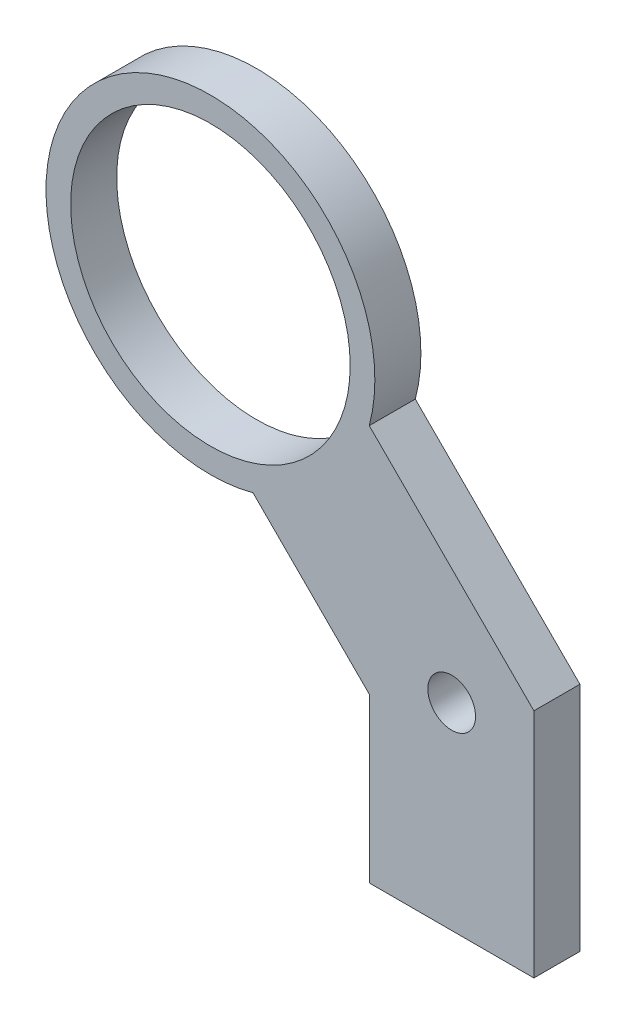
ISO-10303-21;
HEADER;
FILE_DESCRIPTION(('STEP AP214'),'2;1');
FILE_NAME('part.step','',(''),(''),'','','');
FILE_SCHEMA(('AUTOMOTIVE_DESIGN { 1 0 10303 214 1 1 1 1 }'));
ENDSEC;
DATA;
#1=APPLICATION_CONTEXT('core data for automotive mechanical design processes');
#2=APPLICATION_PROTOCOL_DEFINITION('international standard','automotive_design',2000,#1);
#3=PRODUCT_CONTEXT('',#1,'mechanical');
#4=PRODUCT('Part','Part','',(#3));
#5=PRODUCT_RELATED_PRODUCT_CATEGORY('part','',(#4));
#6=PRODUCT_DEFINITION_FORMATION('','',#4);
#7=PRODUCT_DEFINITION_CONTEXT('part definition',#1,'design');
#8=PRODUCT_DEFINITION('design','',#6,#7);
#9=PRODUCT_DEFINITION_SHAPE('','',#8);
#10=(LENGTH_UNIT() NAMED_UNIT(*) SI_UNIT(.MILLI.,.METRE.));
#11=(NAMED_UNIT(*) PLANE_ANGLE_UNIT() SI_UNIT($,.RADIAN.));
#12=(NAMED_UNIT(*) SI_UNIT($,.STERADIAN.) SOLID_ANGLE_UNIT());
#13=UNCERTAINTY_MEASURE_WITH_UNIT(LENGTH_MEASURE(1.E-05),#10,'distance_accuracy_value','');
#14=(GEOMETRIC_REPRESENTATION_CONTEXT(3) GLOBAL_UNCERTAINTY_ASSIGNED_CONTEXT((#13)) GLOBAL_UNIT_ASSIGNED_CONTEXT((#10,
#11,#12)) REPRESENTATION_CONTEXT('',''));
#15=CARTESIAN_POINT('',(0.,0.,0.));
#16=DIRECTION('',(0.,0.,1.));
#17=DIRECTION('',(1.,0.,0.));
#18=AXIS2_PLACEMENT_3D('',#15,#16,#17);
#19=CARTESIAN_POINT('',(-29.3449314192418,29.3449314192417,5.6));
#20=DIRECTION('',(0.,0.,1.));
#21=DIRECTION('',(1.,0.,0.));
#22=AXIS2_PLACEMENT_3D('',#19,#20,#21);
#23=PLANE('',#22);
#24=CARTESIAN_POINT('',(-29.3449314192418,29.3449314192417,5.6));
#25=DIRECTION('',(0.,0.,1.));
#26=DIRECTION('',(1.,0.,0.));
#27=AXIS2_PLACEMENT_3D('',#24,#25,#26);
#28=CIRCLE('',#27,17.);
#29=CARTESIAN_POINT('',(-12.3449314192418,29.3449314192417,5.6));
#30=VERTEX_POINT('',#29);
#31=EDGE_CURVE('E174',#30,#30,#28,.T.);
#32=ORIENTED_EDGE('',*,*,#31,.F.);
#33=EDGE_LOOP('',(#32));
#34=FACE_BOUND('',#33,.T.);
#35=CARTESIAN_POINT('',(-29.3449314192418,29.3449314192417,5.6));
#36=DIRECTION('',(0.,0.,1.));
#37=DIRECTION('',(1.,0.,0.));
#38=AXIS2_PLACEMENT_3D('',#35,#36,#37);
#39=CIRCLE('',#38,20.);
#40=CARTESIAN_POINT('',(-10.0264148934604,24.1685505171913,5.6));
#41=VERTEX_POINT('',#40);
#42=CARTESIAN_POINT('',(-24.1685505171913,10.0264148934603,5.6));
#43=VERTEX_POINT('',#42);
#44=EDGE_CURVE('E129',#41,#43,#39,.T.);
#45=ORIENTED_EDGE('',*,*,#44,.T.);
#46=DIRECTION('',(0.707106781186549,-0.707106781186546,0.));
#47=VECTOR('',#46,1.);
#48=CARTESIAN_POINT('',(-10.,-4.14213562373095,5.6));
#49=LINE('',#48,#47);
#50=CARTESIAN_POINT('',(-10.,-4.14213562373095,5.6));
#51=VERTEX_POINT('',#50);
#52=EDGE_CURVE('E87',#43,#51,#49,.T.);
#53=ORIENTED_EDGE('',*,*,#52,.T.);
#54=DIRECTION('',(0.,-1.,0.));
#55=VECTOR('',#54,1.);
#56=CARTESIAN_POINT('',(-10.,-4.14213562373095,5.6));
#57=LINE('',#56,#55);
#58=CARTESIAN_POINT('',(-10.,-24.,5.6));
#59=VERTEX_POINT('',#58);
#60=EDGE_CURVE('E100',#51,#59,#57,.T.);
#61=ORIENTED_EDGE('',*,*,#60,.T.);
#62=DIRECTION('',(1.,0.,0.));
#63=VECTOR('',#62,1.);
#64=CARTESIAN_POINT('',(-10.,-24.,5.6));
#65=LINE('',#64,#63);
#66=CARTESIAN_POINT('',(10.,-24.,5.6));
#67=VERTEX_POINT('',#66);
#68=EDGE_CURVE('E94',#59,#67,#65,.T.);
#69=ORIENTED_EDGE('',*,*,#68,.T.);
#70=DIRECTION('',(0.,1.,0.));
#71=VECTOR('',#70,1.);
#72=CARTESIAN_POINT('',(10.,-24.,5.6));
#73=LINE('',#72,#71);
#74=CARTESIAN_POINT('',(10.,4.14213562373095,5.6));
#75=VERTEX_POINT('',#74);
#76=EDGE_CURVE('E98',#67,#75,#73,.T.);
#77=ORIENTED_EDGE('',*,*,#76,.T.);
#78=DIRECTION('',(-0.707106781186549,0.707106781186546,0.));
#79=VECTOR('',#78,1.);
#80=CARTESIAN_POINT('',(10.,4.14213562373095,5.6));
#81=LINE('',#80,#79);
#82=EDGE_CURVE('E50',#75,#41,#81,.T.);
#83=ORIENTED_EDGE('',*,*,#82,.T.);
#84=EDGE_LOOP('',(#45,#53,#61,#69,#77,#83));
#85=FACE_BOUND('',#84,.T.);
#86=CARTESIAN_POINT('',(0.,0.,5.6));
#87=DIRECTION('',(0.,0.,1.));
#88=DIRECTION('',(1.,0.,0.));
#89=AXIS2_PLACEMENT_3D('',#86,#87,#88);
#90=CIRCLE('',#89,2.9);
#91=CARTESIAN_POINT('',(2.9,0.,5.6));
#92=VERTEX_POINT('',#91);
#93=EDGE_CURVE('E122',#92,#92,#90,.T.);
#94=ORIENTED_EDGE('',*,*,#93,.F.);
#95=EDGE_LOOP('',(#94));
#96=FACE_BOUND('',#95,.T.);
#97=ADVANCED_FACE('F33',(#34,#85,#96),#23,.T.);
#98=CARTESIAN_POINT('',(-29.3449314192418,29.3449314192417,0.));
#99=DIRECTION('',(0.,0.,1.));
#100=DIRECTION('',(1.,0.,0.));
#101=AXIS2_PLACEMENT_3D('',#98,#99,#100);
#102=PLANE('',#101);
#103=CARTESIAN_POINT('',(-29.3449314192418,29.3449314192417,0.));
#104=DIRECTION('',(0.,0.,1.));
#105=DIRECTION('',(1.,0.,0.));
#106=AXIS2_PLACEMENT_3D('',#103,#104,#105);
#107=CIRCLE('',#106,17.);
#108=CARTESIAN_POINT('',(-12.3449314192418,29.3449314192417,0.));
#109=VERTEX_POINT('',#108);
#110=EDGE_CURVE('E172',#109,#109,#107,.T.);
#111=ORIENTED_EDGE('',*,*,#110,.T.);
#112=EDGE_LOOP('',(#111));
#113=FACE_BOUND('',#112,.T.);
#114=CARTESIAN_POINT('',(-29.3449314192418,29.3449314192417,0.));
#115=DIRECTION('',(0.,0.,1.));
#116=DIRECTION('',(1.,0.,0.));
#117=AXIS2_PLACEMENT_3D('',#114,#115,#116);
#118=CIRCLE('',#117,20.);
#119=CARTESIAN_POINT('',(-10.0264148934604,24.1685505171913,0.));
#120=VERTEX_POINT('',#119);
#121=CARTESIAN_POINT('',(-24.1685505171913,10.0264148934603,0.));
#122=VERTEX_POINT('',#121);
#123=EDGE_CURVE('E118',#120,#122,#118,.T.);
#124=ORIENTED_EDGE('',*,*,#123,.F.);
#125=DIRECTION('',(-0.707106781186549,0.707106781186546,0.));
#126=VECTOR('',#125,1.);
#127=CARTESIAN_POINT('',(10.,4.14213562373095,0.));
#128=LINE('',#127,#126);
#129=CARTESIAN_POINT('',(10.,4.14213562373095,0.));
#130=VERTEX_POINT('',#129);
#131=EDGE_CURVE('E79',#130,#120,#128,.T.);
#132=ORIENTED_EDGE('',*,*,#131,.F.);
#133=DIRECTION('',(0.,1.,0.));
#134=VECTOR('',#133,1.);
#135=CARTESIAN_POINT('',(10.,-24.,0.));
#136=LINE('',#135,#134);
#137=CARTESIAN_POINT('',(10.,-24.,0.));
#138=VERTEX_POINT('',#137);
#139=EDGE_CURVE('E73',#138,#130,#136,.T.);
#140=ORIENTED_EDGE('',*,*,#139,.F.);
#141=DIRECTION('',(1.,0.,0.));
#142=VECTOR('',#141,1.);
#143=CARTESIAN_POINT('',(-10.,-24.,0.));
#144=LINE('',#143,#142);
#145=CARTESIAN_POINT('',(-10.,-24.,0.));
#146=VERTEX_POINT('',#145);
#147=EDGE_CURVE('E108',#146,#138,#144,.T.);
#148=ORIENTED_EDGE('',*,*,#147,.F.);
#149=DIRECTION('',(0.,-1.,0.));
#150=VECTOR('',#149,1.);
#151=CARTESIAN_POINT('',(-10.,-4.14213562373095,0.));
#152=LINE('',#151,#150);
#153=CARTESIAN_POINT('',(-10.,-4.14213562373095,0.));
#154=VERTEX_POINT('',#153);
#155=EDGE_CURVE('E124',#154,#146,#152,.T.);
#156=ORIENTED_EDGE('',*,*,#155,.F.);
#157=DIRECTION('',(0.707106781186549,-0.707106781186546,0.));
#158=VECTOR('',#157,1.);
#159=CARTESIAN_POINT('',(-10.,-4.14213562373095,0.));
#160=LINE('',#159,#158);
#161=EDGE_CURVE('E121',#122,#154,#160,.T.);
#162=ORIENTED_EDGE('',*,*,#161,.F.);
#163=EDGE_LOOP('',(#124,#132,#140,#148,#156,#162));
#164=FACE_BOUND('',#163,.T.);
#165=CARTESIAN_POINT('',(0.,0.,0.));
#166=DIRECTION('',(0.,0.,1.));
#167=DIRECTION('',(1.,0.,0.));
#168=AXIS2_PLACEMENT_3D('',#165,#166,#167);
#169=CIRCLE('',#168,2.9);
#170=CARTESIAN_POINT('',(2.9,0.,0.));
#171=VERTEX_POINT('',#170);
#172=EDGE_CURVE('E176',#171,#171,#169,.T.);
#173=ORIENTED_EDGE('',*,*,#172,.T.);
#174=EDGE_LOOP('',(#173));
#175=FACE_BOUND('',#174,.T.);
#176=ADVANCED_FACE('F138',(#113,#164,#175),#102,.F.);
#177=CARTESIAN_POINT('',(-29.3449314192418,29.3449314192417,5.6));
#178=DIRECTION('',(0.,0.,-1.));
#179=DIRECTION('',(-1.,0.,0.));
#180=AXIS2_PLACEMENT_3D('',#177,#178,#179);
#181=CYLINDRICAL_SURFACE('',#180,20.);
#182=ORIENTED_EDGE('',*,*,#123,.T.);
#183=DIRECTION('',(0.,0.,-1.));
#184=VECTOR('',#183,1.);
#185=CARTESIAN_POINT('',(-24.1685505171913,10.0264148934603,5.6));
#186=LINE('',#185,#184);
#187=EDGE_CURVE('E11',#43,#122,#186,.T.);
#188=ORIENTED_EDGE('',*,*,#187,.F.);
#189=ORIENTED_EDGE('',*,*,#44,.F.);
#190=DIRECTION('',(0.,0.,-1.));
#191=VECTOR('',#190,1.);
#192=CARTESIAN_POINT('',(-10.0264148934604,24.1685505171913,5.6));
#193=LINE('',#192,#191);
#194=EDGE_CURVE('E114',#41,#120,#193,.T.);
#195=ORIENTED_EDGE('',*,*,#194,.T.);
#196=EDGE_LOOP('',(#182,#188,#189,#195));
#197=FACE_BOUND('',#196,.T.);
#198=ADVANCED_FACE('F35',(#197),#181,.T.);
#199=CARTESIAN_POINT('',(-10.,-4.14213562373095,5.6));
#200=DIRECTION('',(0.707106781186546,0.707106781186549,0.));
#201=DIRECTION('',(-0.707106781186549,0.707106781186546,0.));
#202=AXIS2_PLACEMENT_3D('',#199,#200,#201);
#203=PLANE('',#202);
#204=ORIENTED_EDGE('',*,*,#161,.T.);
#205=DIRECTION('',(0.,0.,-1.));
#206=VECTOR('',#205,1.);
#207=CARTESIAN_POINT('',(-10.,-4.14213562373095,5.6));
#208=LINE('',#207,#206);
#209=EDGE_CURVE('E42',#51,#154,#208,.T.);
#210=ORIENTED_EDGE('',*,*,#209,.F.);
#211=ORIENTED_EDGE('',*,*,#52,.F.);
#212=ORIENTED_EDGE('',*,*,#187,.T.);
#213=EDGE_LOOP('',(#204,#210,#211,#212));
#214=FACE_BOUND('',#213,.T.);
#215=ADVANCED_FACE('F213',(#214),#203,.F.);
#216=CARTESIAN_POINT('',(-10.,-4.14213562373095,5.6));
#217=DIRECTION('',(1.,0.,0.));
#218=DIRECTION('',(0.,1.,0.));
#219=AXIS2_PLACEMENT_3D('',#216,#217,#218);
#220=PLANE('',#219);
#221=ORIENTED_EDGE('',*,*,#155,.T.);
#222=DIRECTION('',(0.,0.,-1.));
#223=VECTOR('',#222,1.);
#224=CARTESIAN_POINT('',(-10.,-24.,5.6));
#225=LINE('',#224,#223);
#226=EDGE_CURVE('E109',#59,#146,#225,.T.);
#227=ORIENTED_EDGE('',*,*,#226,.F.);
#228=ORIENTED_EDGE('',*,*,#60,.F.);
#229=ORIENTED_EDGE('',*,*,#209,.T.);
#230=EDGE_LOOP('',(#221,#227,#228,#229));
#231=FACE_BOUND('',#230,.T.);
#232=ADVANCED_FACE('F135',(#231),#220,.F.);
#233=CARTESIAN_POINT('',(-10.,-24.,5.6));
#234=DIRECTION('',(0.,1.,0.));
#235=DIRECTION('',(-1.,0.,0.));
#236=AXIS2_PLACEMENT_3D('',#233,#234,#235);
#237=PLANE('',#236);
#238=ORIENTED_EDGE('',*,*,#147,.T.);
#239=DIRECTION('',(0.,0.,-1.));
#240=VECTOR('',#239,1.);
#241=CARTESIAN_POINT('',(10.,-24.,5.6));
#242=LINE('',#241,#240);
#243=EDGE_CURVE('E105',#67,#138,#242,.T.);
#244=ORIENTED_EDGE('',*,*,#243,.F.);
#245=ORIENTED_EDGE('',*,*,#68,.F.);
#246=ORIENTED_EDGE('',*,*,#226,.T.);
#247=EDGE_LOOP('',(#238,#244,#245,#246));
#248=FACE_BOUND('',#247,.T.);
#249=ADVANCED_FACE('F106',(#248),#237,.F.);
#250=CARTESIAN_POINT('',(10.,-24.,5.6));
#251=DIRECTION('',(-1.,0.,0.));
#252=DIRECTION('',(0.,-1.,0.));
#253=AXIS2_PLACEMENT_3D('',#250,#251,#252);
#254=PLANE('',#253);
#255=ORIENTED_EDGE('',*,*,#139,.T.);
#256=DIRECTION('',(0.,0.,-1.));
#257=VECTOR('',#256,1.);
#258=CARTESIAN_POINT('',(10.,4.14213562373095,5.6));
#259=LINE('',#258,#257);
#260=EDGE_CURVE('E110',#75,#130,#259,.T.);
#261=ORIENTED_EDGE('',*,*,#260,.F.);
#262=ORIENTED_EDGE('',*,*,#76,.F.);
#263=ORIENTED_EDGE('',*,*,#243,.T.);
#264=EDGE_LOOP('',(#255,#261,#262,#263));
#265=FACE_BOUND('',#264,.T.);
#266=ADVANCED_FACE('F112',(#265),#254,.F.);
#267=CARTESIAN_POINT('',(10.,4.14213562373095,5.6));
#268=DIRECTION('',(-0.707106781186546,-0.707106781186549,0.));
#269=DIRECTION('',(0.707106781186549,-0.707106781186546,0.));
#270=AXIS2_PLACEMENT_3D('',#267,#268,#269);
#271=PLANE('',#270);
#272=ORIENTED_EDGE('',*,*,#131,.T.);
#273=ORIENTED_EDGE('',*,*,#194,.F.);
#274=ORIENTED_EDGE('',*,*,#82,.F.);
#275=ORIENTED_EDGE('',*,*,#260,.T.);
#276=EDGE_LOOP('',(#272,#273,#274,#275));
#277=FACE_BOUND('',#276,.T.);
#278=ADVANCED_FACE('F143',(#277),#271,.F.);
#279=CARTESIAN_POINT('',(0.,0.,5.6));
#280=DIRECTION('',(0.,0.,-1.));
#281=DIRECTION('',(-1.,0.,0.));
#282=AXIS2_PLACEMENT_3D('',#279,#280,#281);
#283=CYLINDRICAL_SURFACE('',#282,2.9);
#284=ORIENTED_EDGE('',*,*,#93,.T.);
#285=EDGE_LOOP('',(#284));
#286=FACE_BOUND('',#285,.T.);
#287=ORIENTED_EDGE('',*,*,#172,.F.);
#288=EDGE_LOOP('',(#287));
#289=FACE_BOUND('',#288,.T.);
#290=ADVANCED_FACE('F145',(#286,#289),#283,.F.);
#291=CARTESIAN_POINT('',(-29.3449314192418,29.3449314192417,0.));
#292=DIRECTION('',(0.,0.,1.));
#293=DIRECTION('',(1.,0.,0.));
#294=AXIS2_PLACEMENT_3D('',#291,#292,#293);
#295=CYLINDRICAL_SURFACE('',#294,17.);
#296=ORIENTED_EDGE('',*,*,#110,.F.);
#297=EDGE_LOOP('',(#296));
#298=FACE_BOUND('',#297,.T.);
#299=ORIENTED_EDGE('',*,*,#31,.T.);
#300=EDGE_LOOP('',(#299));
#301=FACE_BOUND('',#300,.T.);
#302=ADVANCED_FACE('F151',(#298,#301),#295,.F.);
#303=CLOSED_SHELL('',(#97,#176,#198,#215,#232,#249,#266,#278,#290,#302));
#304=MANIFOLD_SOLID_BREP('B2',#303);
#305=ADVANCED_BREP_SHAPE_REPRESENTATION('',(#18,#304),#14);
#306=SHAPE_DEFINITION_REPRESENTATION(#9,#305);
ENDSEC;
END-ISO-10303-21;
